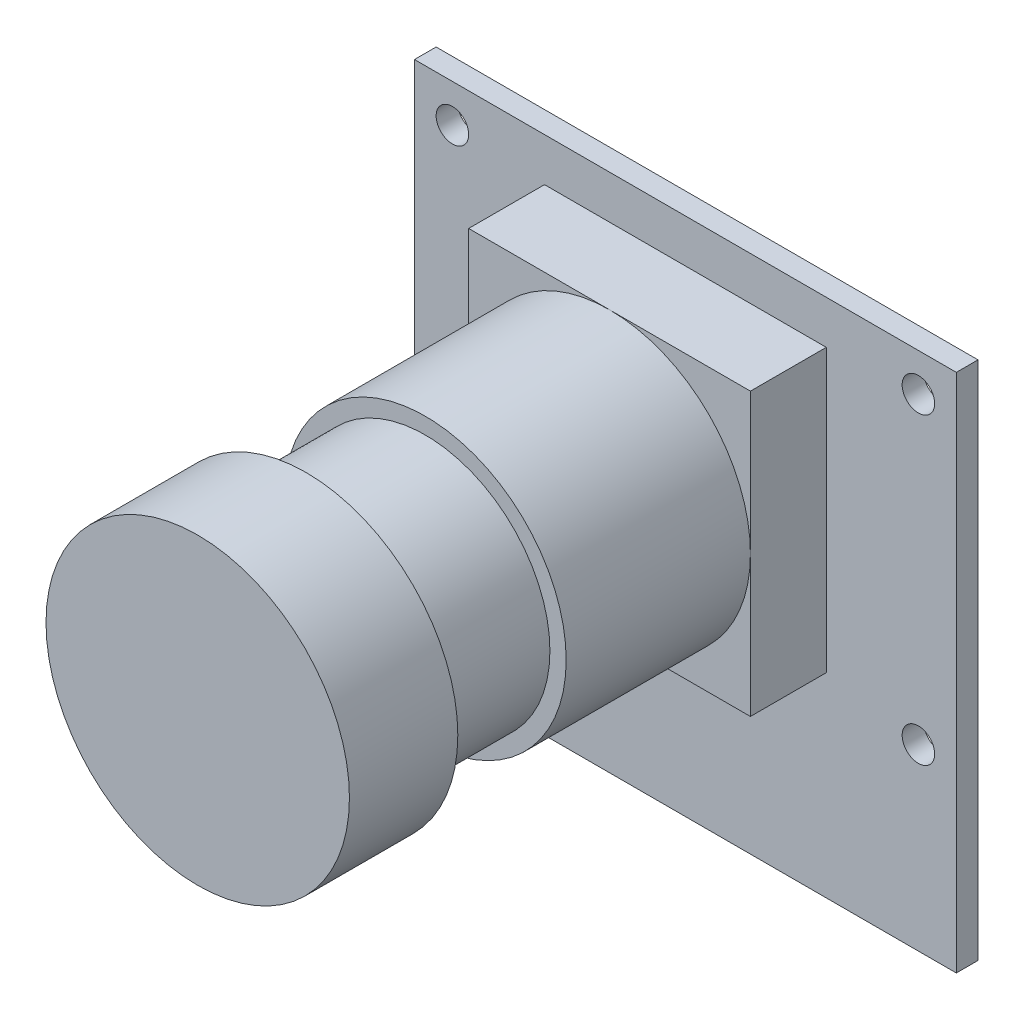
ISO-10303-21;
HEADER;
FILE_DESCRIPTION(('STEP AP214'),'2;1');
FILE_NAME('part.step','',(''),(''),'','','');
FILE_SCHEMA(('AUTOMOTIVE_DESIGN { 1 0 10303 214 1 1 1 1 }'));
ENDSEC;
DATA;
#1=APPLICATION_CONTEXT('core data for automotive mechanical design processes');
#2=APPLICATION_PROTOCOL_DEFINITION('international standard','automotive_design',2000,#1);
#3=PRODUCT_CONTEXT('',#1,'mechanical');
#4=PRODUCT('Part','Part','',(#3));
#5=PRODUCT_RELATED_PRODUCT_CATEGORY('part','',(#4));
#6=PRODUCT_DEFINITION_FORMATION('','',#4);
#7=PRODUCT_DEFINITION_CONTEXT('part definition',#1,'design');
#8=PRODUCT_DEFINITION('design','',#6,#7);
#9=PRODUCT_DEFINITION_SHAPE('','',#8);
#10=(LENGTH_UNIT() NAMED_UNIT(*) SI_UNIT(.MILLI.,.METRE.));
#11=(NAMED_UNIT(*) PLANE_ANGLE_UNIT() SI_UNIT($,.RADIAN.));
#12=(NAMED_UNIT(*) SI_UNIT($,.STERADIAN.) SOLID_ANGLE_UNIT());
#13=UNCERTAINTY_MEASURE_WITH_UNIT(LENGTH_MEASURE(1.E-05),#10,'distance_accuracy_value','');
#14=(GEOMETRIC_REPRESENTATION_CONTEXT(3) GLOBAL_UNCERTAINTY_ASSIGNED_CONTEXT((#13)) GLOBAL_UNIT_ASSIGNED_CONTEXT((#10,
#11,#12)) REPRESENTATION_CONTEXT('',''));
#15=CARTESIAN_POINT('',(0.,0.,0.));
#16=DIRECTION('',(0.,0.,1.));
#17=DIRECTION('',(1.,0.,0.));
#18=AXIS2_PLACEMENT_3D('',#15,#16,#17);
#19=CARTESIAN_POINT('',(0.,0.,4.5));
#20=DIRECTION('',(0.,0.,1.));
#21=DIRECTION('',(1.,0.,0.));
#22=AXIS2_PLACEMENT_3D('',#19,#20,#21);
#23=PLANE('',#22);
#24=CARTESIAN_POINT('',(0.,3.5,4.5));
#25=DIRECTION('',(0.,0.,1.));
#26=DIRECTION('',(1.,0.,0.));
#27=AXIS2_PLACEMENT_3D('',#24,#25,#26);
#28=CIRCLE('',#27,6.5);
#29=CARTESIAN_POINT('',(6.5,3.5,4.5));
#30=VERTEX_POINT('',#29);
#31=CARTESIAN_POINT('',(0.,10.,4.5));
#32=VERTEX_POINT('',#31);
#33=EDGE_CURVE('E218',#30,#32,#28,.T.);
#34=ORIENTED_EDGE('',*,*,#33,.F.);
#35=DIRECTION('',(0.,1.,0.));
#36=VECTOR('',#35,1.);
#37=CARTESIAN_POINT('',(6.5,10.,4.5));
#38=LINE('',#37,#36);
#39=CARTESIAN_POINT('',(6.5,10.,4.5));
#40=VERTEX_POINT('',#39);
#41=EDGE_CURVE('E239',#30,#40,#38,.T.);
#42=ORIENTED_EDGE('',*,*,#41,.T.);
#43=DIRECTION('',(-1.,0.,0.));
#44=VECTOR('',#43,1.);
#45=CARTESIAN_POINT('',(-6.5,10.,4.5));
#46=LINE('',#45,#44);
#47=EDGE_CURVE('E244',#40,#32,#46,.T.);
#48=ORIENTED_EDGE('',*,*,#47,.T.);
#49=EDGE_LOOP('',(#34,#42,#48));
#50=FACE_BOUND('',#49,.T.);
#51=ADVANCED_FACE('F41',(#50),#23,.T.);
#52=CARTESIAN_POINT('',(-6.5,3.5,4.5));
#53=VERTEX_POINT('',#52);
#54=EDGE_CURVE('E51',#32,#53,#28,.T.);
#55=ORIENTED_EDGE('',*,*,#54,.F.);
#56=CARTESIAN_POINT('',(-6.5,10.,4.5));
#57=VERTEX_POINT('',#56);
#58=EDGE_CURVE('E243',#32,#57,#46,.T.);
#59=ORIENTED_EDGE('',*,*,#58,.T.);
#60=DIRECTION('',(0.,-1.,0.));
#61=VECTOR('',#60,1.);
#62=CARTESIAN_POINT('',(-6.5,10.,4.5));
#63=LINE('',#62,#61);
#64=EDGE_CURVE('E229',#57,#53,#63,.T.);
#65=ORIENTED_EDGE('',*,*,#64,.T.);
#66=EDGE_LOOP('',(#55,#59,#65));
#67=FACE_BOUND('',#66,.T.);
#68=ADVANCED_FACE('F335',(#67),#23,.T.);
#69=CARTESIAN_POINT('',(0.,-3.,4.5));
#70=VERTEX_POINT('',#69);
#71=EDGE_CURVE('E325',#53,#70,#28,.T.);
#72=ORIENTED_EDGE('',*,*,#71,.F.);
#73=CARTESIAN_POINT('',(-6.5,-3.,4.5));
#74=VERTEX_POINT('',#73);
#75=EDGE_CURVE('E234',#53,#74,#63,.T.);
#76=ORIENTED_EDGE('',*,*,#75,.T.);
#77=DIRECTION('',(1.,0.,0.));
#78=VECTOR('',#77,1.);
#79=CARTESIAN_POINT('',(-6.5,-3.,4.5));
#80=LINE('',#79,#78);
#81=EDGE_CURVE('E235',#74,#70,#80,.T.);
#82=ORIENTED_EDGE('',*,*,#81,.T.);
#83=EDGE_LOOP('',(#72,#76,#82));
#84=FACE_BOUND('',#83,.T.);
#85=ADVANCED_FACE('F408',(#84),#23,.T.);
#86=CARTESIAN_POINT('',(0.,0.,1.));
#87=DIRECTION('',(0.,0.,-1.));
#88=DIRECTION('',(-1.,0.,0.));
#89=AXIS2_PLACEMENT_3D('',#86,#87,#88);
#90=PLANE('',#89);
#91=CARTESIAN_POINT('',(10.75,-3.75,1.));
#92=DIRECTION('',(0.,0.,1.));
#93=DIRECTION('',(1.,0.,0.));
#94=AXIS2_PLACEMENT_3D('',#91,#92,#93);
#95=CIRCLE('',#94,0.75);
#96=CARTESIAN_POINT('',(11.5,-3.75,1.));
#97=VERTEX_POINT('',#96);
#98=EDGE_CURVE('E184',#97,#97,#95,.T.);
#99=ORIENTED_EDGE('',*,*,#98,.F.);
#100=EDGE_LOOP('',(#99));
#101=FACE_BOUND('',#100,.T.);
#102=CARTESIAN_POINT('',(-10.75,10.25,1.));
#103=DIRECTION('',(0.,0.,1.));
#104=DIRECTION('',(1.,0.,0.));
#105=AXIS2_PLACEMENT_3D('',#102,#103,#104);
#106=CIRCLE('',#105,0.75);
#107=CARTESIAN_POINT('',(-10.,10.25,1.));
#108=VERTEX_POINT('',#107);
#109=EDGE_CURVE('E183',#108,#108,#106,.T.);
#110=ORIENTED_EDGE('',*,*,#109,.F.);
#111=EDGE_LOOP('',(#110));
#112=FACE_BOUND('',#111,.T.);
#113=CARTESIAN_POINT('',(-10.75,-3.75,1.));
#114=DIRECTION('',(0.,0.,1.));
#115=DIRECTION('',(1.,0.,0.));
#116=AXIS2_PLACEMENT_3D('',#113,#114,#115);
#117=CIRCLE('',#116,0.75);
#118=CARTESIAN_POINT('',(-10.,-3.75,1.));
#119=VERTEX_POINT('',#118);
#120=EDGE_CURVE('E169',#119,#119,#117,.T.);
#121=ORIENTED_EDGE('',*,*,#120,.F.);
#122=EDGE_LOOP('',(#121));
#123=FACE_BOUND('',#122,.T.);
#124=CARTESIAN_POINT('',(10.75,10.25,1.));
#125=DIRECTION('',(0.,0.,1.));
#126=DIRECTION('',(1.,0.,0.));
#127=AXIS2_PLACEMENT_3D('',#124,#125,#126);
#128=CIRCLE('',#127,0.75);
#129=CARTESIAN_POINT('',(11.5,10.25,1.));
#130=VERTEX_POINT('',#129);
#131=EDGE_CURVE('E193',#130,#130,#128,.T.);
#132=ORIENTED_EDGE('',*,*,#131,.F.);
#133=EDGE_LOOP('',(#132));
#134=FACE_BOUND('',#133,.T.);
#135=DIRECTION('',(0.,1.,0.));
#136=VECTOR('',#135,1.);
#137=CARTESIAN_POINT('',(12.5,-12.,1.));
#138=LINE('',#137,#136);
#139=CARTESIAN_POINT('',(12.5,-12.,1.));
#140=VERTEX_POINT('',#139);
#141=CARTESIAN_POINT('',(12.5,12.,1.));
#142=VERTEX_POINT('',#141);
#143=EDGE_CURVE('E280',#140,#142,#138,.T.);
#144=ORIENTED_EDGE('',*,*,#143,.T.);
#145=DIRECTION('',(-1.,0.,0.));
#146=VECTOR('',#145,1.);
#147=CARTESIAN_POINT('',(-12.5,12.,1.));
#148=LINE('',#147,#146);
#149=CARTESIAN_POINT('',(-12.5,12.,1.));
#150=VERTEX_POINT('',#149);
#151=EDGE_CURVE('E284',#142,#150,#148,.T.);
#152=ORIENTED_EDGE('',*,*,#151,.T.);
#153=DIRECTION('',(0.,-1.,0.));
#154=VECTOR('',#153,1.);
#155=CARTESIAN_POINT('',(-12.5,-12.,1.));
#156=LINE('',#155,#154);
#157=CARTESIAN_POINT('',(-12.5,-12.,1.));
#158=VERTEX_POINT('',#157);
#159=EDGE_CURVE('E288',#150,#158,#156,.T.);
#160=ORIENTED_EDGE('',*,*,#159,.T.);
#161=DIRECTION('',(1.,0.,0.));
#162=VECTOR('',#161,1.);
#163=CARTESIAN_POINT('',(-12.5,-12.,1.));
#164=LINE('',#163,#162);
#165=EDGE_CURVE('E291',#158,#140,#164,.T.);
#166=ORIENTED_EDGE('',*,*,#165,.T.);
#167=EDGE_LOOP('',(#144,#152,#160,#166));
#168=FACE_BOUND('',#167,.T.);
#169=DIRECTION('',(0.,-1.,0.));
#170=VECTOR('',#169,1.);
#171=CARTESIAN_POINT('',(-6.5,10.,1.));
#172=LINE('',#171,#170);
#173=CARTESIAN_POINT('',(-6.5,10.,1.));
#174=VERTEX_POINT('',#173);
#175=CARTESIAN_POINT('',(-6.5,-3.,1.));
#176=VERTEX_POINT('',#175);
#177=EDGE_CURVE('E224',#174,#176,#172,.T.);
#178=ORIENTED_EDGE('',*,*,#177,.F.);
#179=DIRECTION('',(-1.,0.,0.));
#180=VECTOR('',#179,1.);
#181=CARTESIAN_POINT('',(-6.5,10.,1.));
#182=LINE('',#181,#180);
#183=CARTESIAN_POINT('',(6.5,10.,1.));
#184=VERTEX_POINT('',#183);
#185=EDGE_CURVE('E260',#184,#174,#182,.T.);
#186=ORIENTED_EDGE('',*,*,#185,.F.);
#187=DIRECTION('',(0.,1.,0.));
#188=VECTOR('',#187,1.);
#189=CARTESIAN_POINT('',(6.5,10.,1.));
#190=LINE('',#189,#188);
#191=CARTESIAN_POINT('',(6.5,-3.,1.));
#192=VERTEX_POINT('',#191);
#193=EDGE_CURVE('E256',#192,#184,#190,.T.);
#194=ORIENTED_EDGE('',*,*,#193,.F.);
#195=DIRECTION('',(1.,0.,0.));
#196=VECTOR('',#195,1.);
#197=CARTESIAN_POINT('',(-6.5,-3.,1.));
#198=LINE('',#197,#196);
#199=EDGE_CURVE('E252',#176,#192,#198,.T.);
#200=ORIENTED_EDGE('',*,*,#199,.F.);
#201=EDGE_LOOP('',(#178,#186,#194,#200));
#202=FACE_BOUND('',#201,.T.);
#203=ADVANCED_FACE('F370',(#101,#112,#123,#134,#168,#202),#90,.F.);
#204=CARTESIAN_POINT('',(12.5,-12.,1.));
#205=DIRECTION('',(-1.,0.,0.));
#206=DIRECTION('',(0.,0.,1.));
#207=AXIS2_PLACEMENT_3D('',#204,#205,#206);
#208=PLANE('',#207);
#209=DIRECTION('',(0.,1.,0.));
#210=VECTOR('',#209,1.);
#211=CARTESIAN_POINT('',(12.5,-12.,0.));
#212=LINE('',#211,#210);
#213=CARTESIAN_POINT('',(12.5,-12.,0.));
#214=VERTEX_POINT('',#213);
#215=CARTESIAN_POINT('',(12.5,12.,0.));
#216=VERTEX_POINT('',#215);
#217=EDGE_CURVE('E279',#214,#216,#212,.T.);
#218=ORIENTED_EDGE('',*,*,#217,.T.);
#219=DIRECTION('',(0.,0.,-1.));
#220=VECTOR('',#219,1.);
#221=CARTESIAN_POINT('',(12.5,12.,1.));
#222=LINE('',#221,#220);
#223=EDGE_CURVE('E45',#142,#216,#222,.T.);
#224=ORIENTED_EDGE('',*,*,#223,.F.);
#225=ORIENTED_EDGE('',*,*,#143,.F.);
#226=DIRECTION('',(0.,0.,-1.));
#227=VECTOR('',#226,1.);
#228=CARTESIAN_POINT('',(12.5,-12.,1.));
#229=LINE('',#228,#227);
#230=EDGE_CURVE('E294',#140,#214,#229,.T.);
#231=ORIENTED_EDGE('',*,*,#230,.T.);
#232=EDGE_LOOP('',(#218,#224,#225,#231));
#233=FACE_BOUND('',#232,.T.);
#234=ADVANCED_FACE('F43',(#233),#208,.F.);
#235=CARTESIAN_POINT('',(-12.5,12.,1.));
#236=DIRECTION('',(0.,-1.,0.));
#237=DIRECTION('',(0.,0.,-1.));
#238=AXIS2_PLACEMENT_3D('',#235,#236,#237);
#239=PLANE('',#238);
#240=DIRECTION('',(-1.,0.,0.));
#241=VECTOR('',#240,1.);
#242=CARTESIAN_POINT('',(-12.5,12.,0.));
#243=LINE('',#242,#241);
#244=CARTESIAN_POINT('',(-12.5,12.,0.));
#245=VERTEX_POINT('',#244);
#246=EDGE_CURVE('E298',#216,#245,#243,.T.);
#247=ORIENTED_EDGE('',*,*,#246,.T.);
#248=DIRECTION('',(0.,0.,-1.));
#249=VECTOR('',#248,1.);
#250=CARTESIAN_POINT('',(-12.5,12.,1.));
#251=LINE('',#250,#249);
#252=EDGE_CURVE('E312',#150,#245,#251,.T.);
#253=ORIENTED_EDGE('',*,*,#252,.F.);
#254=ORIENTED_EDGE('',*,*,#151,.F.);
#255=ORIENTED_EDGE('',*,*,#223,.T.);
#256=EDGE_LOOP('',(#247,#253,#254,#255));
#257=FACE_BOUND('',#256,.T.);
#258=ADVANCED_FACE('F366',(#257),#239,.F.);
#259=CARTESIAN_POINT('',(-12.5,-12.,1.));
#260=DIRECTION('',(1.,0.,0.));
#261=DIRECTION('',(0.,0.,-1.));
#262=AXIS2_PLACEMENT_3D('',#259,#260,#261);
#263=PLANE('',#262);
#264=DIRECTION('',(0.,-1.,0.));
#265=VECTOR('',#264,1.);
#266=CARTESIAN_POINT('',(-12.5,-12.,0.));
#267=LINE('',#266,#265);
#268=CARTESIAN_POINT('',(-12.5,-12.,0.));
#269=VERTEX_POINT('',#268);
#270=EDGE_CURVE('E301',#245,#269,#267,.T.);
#271=ORIENTED_EDGE('',*,*,#270,.T.);
#272=DIRECTION('',(0.,0.,-1.));
#273=VECTOR('',#272,1.);
#274=CARTESIAN_POINT('',(-12.5,-12.,1.));
#275=LINE('',#274,#273);
#276=EDGE_CURVE('E309',#158,#269,#275,.T.);
#277=ORIENTED_EDGE('',*,*,#276,.F.);
#278=ORIENTED_EDGE('',*,*,#159,.F.);
#279=ORIENTED_EDGE('',*,*,#252,.T.);
#280=EDGE_LOOP('',(#271,#277,#278,#279));
#281=FACE_BOUND('',#280,.T.);
#282=ADVANCED_FACE('F368',(#281),#263,.F.);
#283=CARTESIAN_POINT('',(-12.5,-12.,1.));
#284=DIRECTION('',(0.,1.,0.));
#285=DIRECTION('',(0.,0.,1.));
#286=AXIS2_PLACEMENT_3D('',#283,#284,#285);
#287=PLANE('',#286);
#288=DIRECTION('',(1.,0.,0.));
#289=VECTOR('',#288,1.);
#290=CARTESIAN_POINT('',(-12.5,-12.,0.));
#291=LINE('',#290,#289);
#292=CARTESIAN_POINT('',(-7.15,-12.,0.));
#293=VERTEX_POINT('',#292);
#294=EDGE_CURVE('E285',#269,#293,#291,.T.);
#295=ORIENTED_EDGE('',*,*,#294,.T.);
#296=DIRECTION('',(0.,0.,1.));
#297=VECTOR('',#296,1.);
#298=CARTESIAN_POINT('',(-7.15,-12.,-2.));
#299=LINE('',#298,#297);
#300=CARTESIAN_POINT('',(-7.15,-12.,-2.));
#301=VERTEX_POINT('',#300);
#302=EDGE_CURVE('E150',#301,#293,#299,.T.);
#303=ORIENTED_EDGE('',*,*,#302,.F.);
#304=DIRECTION('',(-1.,0.,0.));
#305=VECTOR('',#304,1.);
#306=CARTESIAN_POINT('',(7.15,-12.,-2.));
#307=LINE('',#306,#305);
#308=CARTESIAN_POINT('',(7.15,-12.,-2.));
#309=VERTEX_POINT('',#308);
#310=EDGE_CURVE('E143',#309,#301,#307,.T.);
#311=ORIENTED_EDGE('',*,*,#310,.F.);
#312=DIRECTION('',(0.,0.,1.));
#313=VECTOR('',#312,1.);
#314=CARTESIAN_POINT('',(7.15,-12.,-2.));
#315=LINE('',#314,#313);
#316=CARTESIAN_POINT('',(7.15,-12.,0.));
#317=VERTEX_POINT('',#316);
#318=EDGE_CURVE('E148',#309,#317,#315,.T.);
#319=ORIENTED_EDGE('',*,*,#318,.T.);
#320=EDGE_CURVE('E64',#317,#214,#291,.T.);
#321=ORIENTED_EDGE('',*,*,#320,.T.);
#322=ORIENTED_EDGE('',*,*,#230,.F.);
#323=ORIENTED_EDGE('',*,*,#165,.F.);
#324=ORIENTED_EDGE('',*,*,#276,.T.);
#325=EDGE_LOOP('',(#295,#303,#311,#319,#321,#322,#323,#324));
#326=FACE_BOUND('',#325,.T.);
#327=ADVANCED_FACE('F146',(#326),#287,.F.);
#328=CARTESIAN_POINT('',(0.,0.,0.));
#329=DIRECTION('',(0.,0.,-1.));
#330=DIRECTION('',(-1.,0.,0.));
#331=AXIS2_PLACEMENT_3D('',#328,#329,#330);
#332=PLANE('',#331);
#333=DIRECTION('',(0.,-1.,0.));
#334=VECTOR('',#333,1.);
#335=CARTESIAN_POINT('',(7.15,-12.,0.));
#336=LINE('',#335,#334);
#337=CARTESIAN_POINT('',(7.15,-6.5,0.));
#338=VERTEX_POINT('',#337);
#339=EDGE_CURVE('E59',#338,#317,#336,.T.);
#340=ORIENTED_EDGE('',*,*,#339,.F.);
#341=DIRECTION('',(1.,0.,0.));
#342=VECTOR('',#341,1.);
#343=CARTESIAN_POINT('',(7.15,-6.5,0.));
#344=LINE('',#343,#342);
#345=CARTESIAN_POINT('',(-7.15,-6.5,0.));
#346=VERTEX_POINT('',#345);
#347=EDGE_CURVE('E165',#346,#338,#344,.T.);
#348=ORIENTED_EDGE('',*,*,#347,.F.);
#349=DIRECTION('',(0.,1.,0.));
#350=VECTOR('',#349,1.);
#351=CARTESIAN_POINT('',(-7.15,-12.,0.));
#352=LINE('',#351,#350);
#353=EDGE_CURVE('E372',#293,#346,#352,.T.);
#354=ORIENTED_EDGE('',*,*,#353,.F.);
#355=ORIENTED_EDGE('',*,*,#294,.F.);
#356=ORIENTED_EDGE('',*,*,#270,.F.);
#357=ORIENTED_EDGE('',*,*,#246,.F.);
#358=ORIENTED_EDGE('',*,*,#217,.F.);
#359=ORIENTED_EDGE('',*,*,#320,.F.);
#360=EDGE_LOOP('',(#340,#348,#354,#355,#356,#357,#358,#359));
#361=FACE_BOUND('',#360,.T.);
#362=CARTESIAN_POINT('',(10.75,-3.75,0.));
#363=DIRECTION('',(0.,0.,-1.));
#364=DIRECTION('',(-1.,0.,0.));
#365=AXIS2_PLACEMENT_3D('',#362,#363,#364);
#366=CIRCLE('',#365,0.75);
#367=CARTESIAN_POINT('',(10.,-3.75,0.));
#368=VERTEX_POINT('',#367);
#369=EDGE_CURVE('E188',#368,#368,#366,.F.);
#370=ORIENTED_EDGE('',*,*,#369,.T.);
#371=EDGE_LOOP('',(#370));
#372=FACE_BOUND('',#371,.T.);
#373=CARTESIAN_POINT('',(-10.75,10.25,0.));
#374=DIRECTION('',(0.,0.,-1.));
#375=DIRECTION('',(-1.,0.,0.));
#376=AXIS2_PLACEMENT_3D('',#373,#374,#375);
#377=CIRCLE('',#376,0.75);
#378=CARTESIAN_POINT('',(-11.5,10.25,0.));
#379=VERTEX_POINT('',#378);
#380=EDGE_CURVE('E189',#379,#379,#377,.F.);
#381=ORIENTED_EDGE('',*,*,#380,.T.);
#382=EDGE_LOOP('',(#381));
#383=FACE_BOUND('',#382,.T.);
#384=CARTESIAN_POINT('',(-10.75,-3.75,0.));
#385=DIRECTION('',(0.,0.,-1.));
#386=DIRECTION('',(-1.,0.,0.));
#387=AXIS2_PLACEMENT_3D('',#384,#385,#386);
#388=CIRCLE('',#387,0.75);
#389=CARTESIAN_POINT('',(-11.5,-3.75,0.));
#390=VERTEX_POINT('',#389);
#391=EDGE_CURVE('E174',#390,#390,#388,.F.);
#392=ORIENTED_EDGE('',*,*,#391,.T.);
#393=EDGE_LOOP('',(#392));
#394=FACE_BOUND('',#393,.T.);
#395=CARTESIAN_POINT('',(10.75,10.25,0.));
#396=DIRECTION('',(0.,0.,-1.));
#397=DIRECTION('',(-1.,0.,0.));
#398=AXIS2_PLACEMENT_3D('',#395,#396,#397);
#399=CIRCLE('',#398,0.75);
#400=CARTESIAN_POINT('',(10.,10.25,0.));
#401=VERTEX_POINT('',#400);
#402=EDGE_CURVE('E203',#401,#401,#399,.F.);
#403=ORIENTED_EDGE('',*,*,#402,.T.);
#404=EDGE_LOOP('',(#403));
#405=FACE_BOUND('',#404,.T.);
#406=ADVANCED_FACE('F363',(#361,#372,#383,#394,#405),#332,.T.);
#407=CARTESIAN_POINT('',(-6.5,10.,4.5));
#408=DIRECTION('',(1.,0.,0.));
#409=DIRECTION('',(0.,0.,-1.));
#410=AXIS2_PLACEMENT_3D('',#407,#408,#409);
#411=PLANE('',#410);
#412=ORIENTED_EDGE('',*,*,#177,.T.);
#413=DIRECTION('',(0.,0.,-1.));
#414=VECTOR('',#413,1.);
#415=CARTESIAN_POINT('',(-6.5,-3.,4.5));
#416=LINE('',#415,#414);
#417=EDGE_CURVE('E275',#74,#176,#416,.T.);
#418=ORIENTED_EDGE('',*,*,#417,.F.);
#419=ORIENTED_EDGE('',*,*,#75,.F.);
#420=ORIENTED_EDGE('',*,*,#64,.F.);
#421=DIRECTION('',(0.,0.,-1.));
#422=VECTOR('',#421,1.);
#423=CARTESIAN_POINT('',(-6.5,10.,4.5));
#424=LINE('',#423,#422);
#425=EDGE_CURVE('E248',#57,#174,#424,.T.);
#426=ORIENTED_EDGE('',*,*,#425,.T.);
#427=EDGE_LOOP('',(#412,#418,#419,#420,#426));
#428=FACE_BOUND('',#427,.T.);
#429=ADVANCED_FACE('F351',(#428),#411,.F.);
#430=CARTESIAN_POINT('',(-6.5,-3.,4.5));
#431=DIRECTION('',(0.,1.,0.));
#432=DIRECTION('',(-1.,0.,0.));
#433=AXIS2_PLACEMENT_3D('',#430,#431,#432);
#434=PLANE('',#433);
#435=ORIENTED_EDGE('',*,*,#199,.T.);
#436=DIRECTION('',(0.,0.,-1.));
#437=VECTOR('',#436,1.);
#438=CARTESIAN_POINT('',(6.5,-3.,4.5));
#439=LINE('',#438,#437);
#440=CARTESIAN_POINT('',(6.5,-3.,4.5));
#441=VERTEX_POINT('',#440);
#442=EDGE_CURVE('E271',#441,#192,#439,.T.);
#443=ORIENTED_EDGE('',*,*,#442,.F.);
#444=EDGE_CURVE('E233',#70,#441,#80,.T.);
#445=ORIENTED_EDGE('',*,*,#444,.F.);
#446=ORIENTED_EDGE('',*,*,#81,.F.);
#447=ORIENTED_EDGE('',*,*,#417,.T.);
#448=EDGE_LOOP('',(#435,#443,#445,#446,#447));
#449=FACE_BOUND('',#448,.T.);
#450=ADVANCED_FACE('F427',(#449),#434,.F.);
#451=CARTESIAN_POINT('',(6.5,10.,4.5));
#452=DIRECTION('',(-1.,0.,0.));
#453=DIRECTION('',(0.,-1.,0.));
#454=AXIS2_PLACEMENT_3D('',#451,#452,#453);
#455=PLANE('',#454);
#456=ORIENTED_EDGE('',*,*,#193,.T.);
#457=DIRECTION('',(0.,0.,-1.));
#458=VECTOR('',#457,1.);
#459=CARTESIAN_POINT('',(6.5,10.,4.5));
#460=LINE('',#459,#458);
#461=EDGE_CURVE('E267',#40,#184,#460,.T.);
#462=ORIENTED_EDGE('',*,*,#461,.F.);
#463=ORIENTED_EDGE('',*,*,#41,.F.);
#464=EDGE_CURVE('E240',#441,#30,#38,.T.);
#465=ORIENTED_EDGE('',*,*,#464,.F.);
#466=ORIENTED_EDGE('',*,*,#442,.T.);
#467=EDGE_LOOP('',(#456,#462,#463,#465,#466));
#468=FACE_BOUND('',#467,.T.);
#469=ADVANCED_FACE('F348',(#468),#455,.F.);
#470=CARTESIAN_POINT('',(-6.5,10.,4.5));
#471=DIRECTION('',(0.,-1.,0.));
#472=DIRECTION('',(1.,0.,0.));
#473=AXIS2_PLACEMENT_3D('',#470,#471,#472);
#474=PLANE('',#473);
#475=ORIENTED_EDGE('',*,*,#185,.T.);
#476=ORIENTED_EDGE('',*,*,#425,.F.);
#477=ORIENTED_EDGE('',*,*,#58,.F.);
#478=ORIENTED_EDGE('',*,*,#47,.F.);
#479=ORIENTED_EDGE('',*,*,#461,.T.);
#480=EDGE_LOOP('',(#475,#476,#477,#478,#479));
#481=FACE_BOUND('',#480,.T.);
#482=ADVANCED_FACE('F340',(#481),#474,.F.);
#483=EDGE_CURVE('E228',#70,#30,#28,.T.);
#484=ORIENTED_EDGE('',*,*,#483,.F.);
#485=ORIENTED_EDGE('',*,*,#444,.T.);
#486=ORIENTED_EDGE('',*,*,#464,.T.);
#487=EDGE_LOOP('',(#484,#485,#486));
#488=FACE_BOUND('',#487,.T.);
#489=ADVANCED_FACE('F404',(#488),#23,.T.);
#490=CARTESIAN_POINT('',(0.,3.5,13.));
#491=DIRECTION('',(0.,0.,-1.));
#492=DIRECTION('',(-1.,0.,0.));
#493=AXIS2_PLACEMENT_3D('',#490,#491,#492);
#494=CYLINDRICAL_SURFACE('',#493,6.5);
#495=CARTESIAN_POINT('',(0.,3.5,13.));
#496=DIRECTION('',(0.,0.,1.));
#497=DIRECTION('',(1.,0.,0.));
#498=AXIS2_PLACEMENT_3D('',#495,#496,#497);
#499=CIRCLE('',#498,6.5);
#500=CARTESIAN_POINT('',(6.5,3.5,13.));
#501=VERTEX_POINT('',#500);
#502=EDGE_CURVE('E220',#501,#501,#499,.T.);
#503=ORIENTED_EDGE('',*,*,#502,.F.);
#504=EDGE_LOOP('',(#503));
#505=FACE_BOUND('',#504,.T.);
#506=ORIENTED_EDGE('',*,*,#33,.T.);
#507=ORIENTED_EDGE('',*,*,#54,.T.);
#508=ORIENTED_EDGE('',*,*,#71,.T.);
#509=ORIENTED_EDGE('',*,*,#483,.T.);
#510=EDGE_LOOP('',(#506,#507,#508,#509));
#511=FACE_BOUND('',#510,.T.);
#512=ADVANCED_FACE('F331',(#505,#511),#494,.T.);
#513=CARTESIAN_POINT('',(0.,3.5,13.));
#514=DIRECTION('',(0.,0.,1.));
#515=DIRECTION('',(1.,0.,0.));
#516=AXIS2_PLACEMENT_3D('',#513,#514,#515);
#517=PLANE('',#516);
#518=CARTESIAN_POINT('',(0.,3.5,13.));
#519=DIRECTION('',(0.,0.,1.));
#520=DIRECTION('',(1.,0.,0.));
#521=AXIS2_PLACEMENT_3D('',#518,#519,#520);
#522=CIRCLE('',#521,5.75);
#523=CARTESIAN_POINT('',(5.75,3.5,13.));
#524=VERTEX_POINT('',#523);
#525=EDGE_CURVE('E11',#524,#524,#522,.T.);
#526=ORIENTED_EDGE('',*,*,#525,.F.);
#527=EDGE_LOOP('',(#526));
#528=FACE_BOUND('',#527,.T.);
#529=ORIENTED_EDGE('',*,*,#502,.T.);
#530=EDGE_LOOP('',(#529));
#531=FACE_BOUND('',#530,.T.);
#532=ADVANCED_FACE('F417',(#528,#531),#517,.T.);
#533=CARTESIAN_POINT('',(0.,3.5,18.5));
#534=DIRECTION('',(0.,0.,-1.));
#535=DIRECTION('',(-1.,0.,0.));
#536=AXIS2_PLACEMENT_3D('',#533,#534,#535);
#537=CYLINDRICAL_SURFACE('',#536,5.75);
#538=CARTESIAN_POINT('',(0.,3.5,18.5));
#539=DIRECTION('',(0.,0.,1.));
#540=DIRECTION('',(1.,0.,0.));
#541=AXIS2_PLACEMENT_3D('',#538,#539,#540);
#542=CIRCLE('',#541,5.75);
#543=CARTESIAN_POINT('',(5.75,3.5,18.5));
#544=VERTEX_POINT('',#543);
#545=EDGE_CURVE('E212',#544,#544,#542,.T.);
#546=ORIENTED_EDGE('',*,*,#545,.F.);
#547=EDGE_LOOP('',(#546));
#548=FACE_BOUND('',#547,.T.);
#549=ORIENTED_EDGE('',*,*,#525,.T.);
#550=EDGE_LOOP('',(#549));
#551=FACE_BOUND('',#550,.T.);
#552=ADVANCED_FACE('F580',(#548,#551),#537,.T.);
#553=CARTESIAN_POINT('',(0.,3.5,23.5));
#554=DIRECTION('',(0.,0.,-1.));
#555=DIRECTION('',(-1.,0.,0.));
#556=AXIS2_PLACEMENT_3D('',#553,#554,#555);
#557=CYLINDRICAL_SURFACE('',#556,7.);
#558=CARTESIAN_POINT('',(0.,3.5,23.5));
#559=DIRECTION('',(0.,0.,1.));
#560=DIRECTION('',(1.,0.,0.));
#561=AXIS2_PLACEMENT_3D('',#558,#559,#560);
#562=CIRCLE('',#561,7.);
#563=CARTESIAN_POINT('',(7.,3.5,23.5));
#564=VERTEX_POINT('',#563);
#565=EDGE_CURVE('E208',#564,#564,#562,.T.);
#566=ORIENTED_EDGE('',*,*,#565,.F.);
#567=EDGE_LOOP('',(#566));
#568=FACE_BOUND('',#567,.T.);
#569=CARTESIAN_POINT('',(0.,3.5,18.5));
#570=DIRECTION('',(0.,0.,1.));
#571=DIRECTION('',(1.,0.,0.));
#572=AXIS2_PLACEMENT_3D('',#569,#570,#571);
#573=CIRCLE('',#572,7.);
#574=CARTESIAN_POINT('',(7.,3.5,18.5));
#575=VERTEX_POINT('',#574);
#576=EDGE_CURVE('E207',#575,#575,#573,.T.);
#577=ORIENTED_EDGE('',*,*,#576,.T.);
#578=EDGE_LOOP('',(#577));
#579=FACE_BOUND('',#578,.T.);
#580=ADVANCED_FACE('F590',(#568,#579),#557,.T.);
#581=CARTESIAN_POINT('',(0.,3.5,23.5));
#582=DIRECTION('',(0.,0.,1.));
#583=DIRECTION('',(1.,0.,0.));
#584=AXIS2_PLACEMENT_3D('',#581,#582,#583);
#585=PLANE('',#584);
#586=ORIENTED_EDGE('',*,*,#565,.T.);
#587=EDGE_LOOP('',(#586));
#588=FACE_BOUND('',#587,.T.);
#589=ADVANCED_FACE('F599',(#588),#585,.T.);
#590=CARTESIAN_POINT('',(0.,3.5,18.5));
#591=DIRECTION('',(0.,0.,1.));
#592=DIRECTION('',(1.,0.,0.));
#593=AXIS2_PLACEMENT_3D('',#590,#591,#592);
#594=PLANE('',#593);
#595=ORIENTED_EDGE('',*,*,#545,.T.);
#596=EDGE_LOOP('',(#595));
#597=FACE_BOUND('',#596,.T.);
#598=ORIENTED_EDGE('',*,*,#576,.F.);
#599=EDGE_LOOP('',(#598));
#600=FACE_BOUND('',#599,.T.);
#601=ADVANCED_FACE('F461',(#597,#600),#594,.F.);
#602=CARTESIAN_POINT('',(10.75,10.25,-2.12132034355964));
#603=DIRECTION('',(0.,0.,1.));
#604=DIRECTION('',(1.,0.,0.));
#605=AXIS2_PLACEMENT_3D('',#602,#603,#604);
#606=CYLINDRICAL_SURFACE('',#605,0.75);
#607=ORIENTED_EDGE('',*,*,#131,.T.);
#608=EDGE_LOOP('',(#607));
#609=FACE_BOUND('',#608,.T.);
#610=ORIENTED_EDGE('',*,*,#402,.F.);
#611=EDGE_LOOP('',(#610));
#612=FACE_BOUND('',#611,.T.);
#613=ADVANCED_FACE('F466',(#609,#612),#606,.F.);
#614=CARTESIAN_POINT('',(-10.75,-3.75,-2.12132034355964));
#615=DIRECTION('',(0.,0.,1.));
#616=DIRECTION('',(1.,0.,0.));
#617=AXIS2_PLACEMENT_3D('',#614,#615,#616);
#618=CYLINDRICAL_SURFACE('',#617,0.75);
#619=ORIENTED_EDGE('',*,*,#120,.T.);
#620=EDGE_LOOP('',(#619));
#621=FACE_BOUND('',#620,.T.);
#622=ORIENTED_EDGE('',*,*,#391,.F.);
#623=EDGE_LOOP('',(#622));
#624=FACE_BOUND('',#623,.T.);
#625=ADVANCED_FACE('F471',(#621,#624),#618,.F.);
#626=CARTESIAN_POINT('',(-10.75,10.25,-2.12132034355964));
#627=DIRECTION('',(0.,0.,1.));
#628=DIRECTION('',(1.,0.,0.));
#629=AXIS2_PLACEMENT_3D('',#626,#627,#628);
#630=CYLINDRICAL_SURFACE('',#629,0.75);
#631=ORIENTED_EDGE('',*,*,#109,.T.);
#632=EDGE_LOOP('',(#631));
#633=FACE_BOUND('',#632,.T.);
#634=ORIENTED_EDGE('',*,*,#380,.F.);
#635=EDGE_LOOP('',(#634));
#636=FACE_BOUND('',#635,.T.);
#637=ADVANCED_FACE('F481',(#633,#636),#630,.F.);
#638=CARTESIAN_POINT('',(10.75,-3.75,-2.12132034355964));
#639=DIRECTION('',(0.,0.,1.));
#640=DIRECTION('',(1.,0.,0.));
#641=AXIS2_PLACEMENT_3D('',#638,#639,#640);
#642=CYLINDRICAL_SURFACE('',#641,0.75);
#643=ORIENTED_EDGE('',*,*,#98,.T.);
#644=EDGE_LOOP('',(#643));
#645=FACE_BOUND('',#644,.T.);
#646=ORIENTED_EDGE('',*,*,#369,.F.);
#647=EDGE_LOOP('',(#646));
#648=FACE_BOUND('',#647,.T.);
#649=ADVANCED_FACE('F400',(#645,#648),#642,.F.);
#650=CARTESIAN_POINT('',(7.15,-12.,-2.));
#651=DIRECTION('',(-1.,0.,0.));
#652=DIRECTION('',(0.,-1.,0.));
#653=AXIS2_PLACEMENT_3D('',#650,#651,#652);
#654=PLANE('',#653);
#655=ORIENTED_EDGE('',*,*,#339,.T.);
#656=ORIENTED_EDGE('',*,*,#318,.F.);
#657=DIRECTION('',(0.,-1.,0.));
#658=VECTOR('',#657,1.);
#659=CARTESIAN_POINT('',(7.15,-12.,-2.));
#660=LINE('',#659,#658);
#661=CARTESIAN_POINT('',(7.15,-6.5,-2.));
#662=VERTEX_POINT('',#661);
#663=EDGE_CURVE('E155',#662,#309,#660,.T.);
#664=ORIENTED_EDGE('',*,*,#663,.F.);
#665=DIRECTION('',(0.,0.,1.));
#666=VECTOR('',#665,1.);
#667=CARTESIAN_POINT('',(7.15,-6.5,-2.));
#668=LINE('',#667,#666);
#669=EDGE_CURVE('E384',#662,#338,#668,.T.);
#670=ORIENTED_EDGE('',*,*,#669,.T.);
#671=EDGE_LOOP('',(#655,#656,#664,#670));
#672=FACE_BOUND('',#671,.T.);
#673=ADVANCED_FACE('F167',(#672),#654,.F.);
#674=CARTESIAN_POINT('',(-7.15,-12.,-2.));
#675=DIRECTION('',(1.,0.,0.));
#676=DIRECTION('',(0.,0.,-1.));
#677=AXIS2_PLACEMENT_3D('',#674,#675,#676);
#678=PLANE('',#677);
#679=ORIENTED_EDGE('',*,*,#353,.T.);
#680=DIRECTION('',(0.,0.,1.));
#681=VECTOR('',#680,1.);
#682=CARTESIAN_POINT('',(-7.15,-6.5,-2.));
#683=LINE('',#682,#681);
#684=CARTESIAN_POINT('',(-7.15,-6.5,-2.));
#685=VERTEX_POINT('',#684);
#686=EDGE_CURVE('E176',#685,#346,#683,.T.);
#687=ORIENTED_EDGE('',*,*,#686,.F.);
#688=DIRECTION('',(0.,1.,0.));
#689=VECTOR('',#688,1.);
#690=CARTESIAN_POINT('',(-7.15,-12.,-2.));
#691=LINE('',#690,#689);
#692=EDGE_CURVE('E154',#301,#685,#691,.T.);
#693=ORIENTED_EDGE('',*,*,#692,.F.);
#694=ORIENTED_EDGE('',*,*,#302,.T.);
#695=EDGE_LOOP('',(#679,#687,#693,#694));
#696=FACE_BOUND('',#695,.T.);
#697=ADVANCED_FACE('F389',(#696),#678,.F.);
#698=CARTESIAN_POINT('',(7.15,-6.5,-2.));
#699=DIRECTION('',(0.,-1.,0.));
#700=DIRECTION('',(0.,0.,-1.));
#701=AXIS2_PLACEMENT_3D('',#698,#699,#700);
#702=PLANE('',#701);
#703=ORIENTED_EDGE('',*,*,#347,.T.);
#704=ORIENTED_EDGE('',*,*,#669,.F.);
#705=DIRECTION('',(1.,0.,0.));
#706=VECTOR('',#705,1.);
#707=CARTESIAN_POINT('',(7.15,-6.5,-2.));
#708=LINE('',#707,#706);
#709=EDGE_CURVE('E160',#685,#662,#708,.T.);
#710=ORIENTED_EDGE('',*,*,#709,.F.);
#711=ORIENTED_EDGE('',*,*,#686,.T.);
#712=EDGE_LOOP('',(#703,#704,#710,#711));
#713=FACE_BOUND('',#712,.T.);
#714=ADVANCED_FACE('F388',(#713),#702,.F.);
#715=CARTESIAN_POINT('',(0.,0.,-2.));
#716=DIRECTION('',(0.,0.,1.));
#717=DIRECTION('',(1.,0.,0.));
#718=AXIS2_PLACEMENT_3D('',#715,#716,#717);
#719=PLANE('',#718);
#720=ORIENTED_EDGE('',*,*,#663,.T.);
#721=ORIENTED_EDGE('',*,*,#310,.T.);
#722=ORIENTED_EDGE('',*,*,#692,.T.);
#723=ORIENTED_EDGE('',*,*,#709,.T.);
#724=EDGE_LOOP('',(#720,#721,#722,#723));
#725=FACE_BOUND('',#724,.T.);
#726=ADVANCED_FACE('F158',(#725),#719,.F.);
#727=CLOSED_SHELL('',(#51,#68,#85,#203,#234,#258,#282,#327,#406,#429,#450,#469,#482,#489,#512,
#532,#552,#580,#589,#601,#613,#625,#637,#649,#673,#697,#714,#726));
#728=MANIFOLD_SOLID_BREP('B2',#727);
#729=ADVANCED_BREP_SHAPE_REPRESENTATION('',(#18,#728),#14);
#730=SHAPE_DEFINITION_REPRESENTATION(#9,#729);
ENDSEC;
END-ISO-10303-21;
